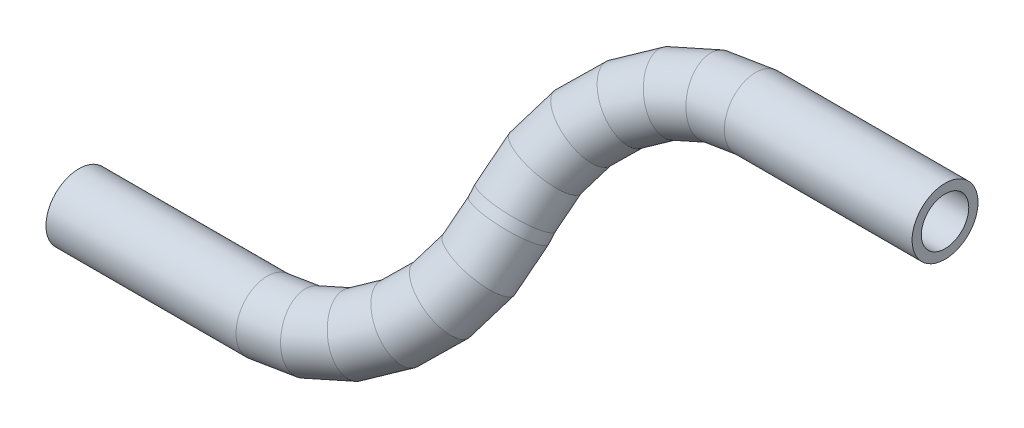
ISO-10303-21;
HEADER;
FILE_DESCRIPTION(('STEP AP214'),'2;1');
FILE_NAME('part.step','',(''),(''),'','','');
FILE_SCHEMA(('AUTOMOTIVE_DESIGN { 1 0 10303 214 1 1 1 1 }'));
ENDSEC;
DATA;
#1=APPLICATION_CONTEXT('core data for automotive mechanical design processes');
#2=APPLICATION_PROTOCOL_DEFINITION('international standard','automotive_design',2000,#1);
#3=PRODUCT_CONTEXT('',#1,'mechanical');
#4=PRODUCT('Part','Part','',(#3));
#5=PRODUCT_RELATED_PRODUCT_CATEGORY('part','',(#4));
#6=PRODUCT_DEFINITION_FORMATION('','',#4);
#7=PRODUCT_DEFINITION_CONTEXT('part definition',#1,'design');
#8=PRODUCT_DEFINITION('design','',#6,#7);
#9=PRODUCT_DEFINITION_SHAPE('','',#8);
#10=(LENGTH_UNIT() NAMED_UNIT(*) SI_UNIT(.MILLI.,.METRE.));
#11=(NAMED_UNIT(*) PLANE_ANGLE_UNIT() SI_UNIT($,.RADIAN.));
#12=(NAMED_UNIT(*) SI_UNIT($,.STERADIAN.) SOLID_ANGLE_UNIT());
#13=UNCERTAINTY_MEASURE_WITH_UNIT(LENGTH_MEASURE(1.E-05),#10,'distance_accuracy_value','');
#14=(GEOMETRIC_REPRESENTATION_CONTEXT(3) GLOBAL_UNCERTAINTY_ASSIGNED_CONTEXT((#13)) GLOBAL_UNIT_ASSIGNED_CONTEXT((#10,
#11,#12)) REPRESENTATION_CONTEXT('',''));
#15=CARTESIAN_POINT('',(0.,0.,0.));
#16=DIRECTION('',(0.,0.,1.));
#17=DIRECTION('',(1.,0.,0.));
#18=AXIS2_PLACEMENT_3D('',#15,#16,#17);
#19=CARTESIAN_POINT('',(-2802.50932273148,-50.1590536512468,36.4426856421346));
#20=DIRECTION('',(-1.,0.,0.));
#21=DIRECTION('',(0.,0.,1.));
#22=AXIS2_PLACEMENT_3D('',#19,#20,#21);
#23=CYLINDRICAL_SURFACE('',#22,3.175);
#24=CARTESIAN_POINT('',(-2803.09277838077,-50.1590536512477,36.4426856421345));
#25=DIRECTION('',(-0.99803668420921,-0.0506704140617951,0.0368142107275359));
#26=DIRECTION('',(0.0626320762284405,-0.807428638534867,0.586631244225063));
#27=AXIS2_PLACEMENT_3D('',#24,#25,#26);
#28=ELLIPSE('',#27,3.18124579009408,3.175);
#29=CARTESIAN_POINT('',(-2802.89353035195,-52.7276826083881,38.3089038181632));
#30=VERTEX_POINT('',#29);
#31=EDGE_CURVE('E45',#30,#30,#28,.T.);
#32=ORIENTED_EDGE('',*,*,#31,.T.);
#33=EDGE_LOOP('',(#32));
#34=FACE_BOUND('',#33,.T.);
#35=CARTESIAN_POINT('',(-2821.29277838077,-50.1590536512468,36.4426856421346));
#36=DIRECTION('',(1.,0.,0.));
#37=DIRECTION('',(0.,0.,-1.));
#38=AXIS2_PLACEMENT_3D('',#35,#36,#37);
#39=CIRCLE('',#38,3.175);
#40=CARTESIAN_POINT('',(-2821.29277838077,-50.1590536512468,33.2676856421346));
#41=VERTEX_POINT('',#40);
#42=EDGE_CURVE('E98',#41,#41,#39,.T.);
#43=ORIENTED_EDGE('',*,*,#42,.T.);
#44=EDGE_LOOP('',(#43));
#45=FACE_BOUND('',#44,.T.);
#46=ADVANCED_FACE('F39',(#34,#45),#23,.T.);
#47=CARTESIAN_POINT('',(-2798.30932314942,-49.6714203188122,36.0883992880472));
#48=DIRECTION('',(-0.99215444605463,-0.101141864075483,0.0734838656125781));
#49=DIRECTION('',(0.101416051901139,-0.994844100558869,0.));
#50=AXIS2_PLACEMENT_3D('',#47,#48,#49);
#51=CYLINDRICAL_SURFACE('',#50,3.175);
#52=CARTESIAN_POINT('',(-2799.37165691525,-49.779716378738,36.1670809811988));
#53=DIRECTION('',(-0.968740889651932,-0.200696700249509,0.145814687961612));
#54=DIRECTION('',(0.248074764368292,-0.783727842874327,0.569411608230085));
#55=AXIS2_PLACEMENT_3D('',#52,#53,#54);
#56=ELLIPSE('',#55,3.20010660903211,3.175);
#57=CARTESIAN_POINT('',(-2798.57779122226,-52.2877290284026,37.9892588319555));
#58=VERTEX_POINT('',#57);
#59=EDGE_CURVE('E136',#58,#58,#56,.T.);
#60=ORIENTED_EDGE('',*,*,#59,.T.);
#61=EDGE_LOOP('',(#60));
#62=FACE_BOUND('',#61,.T.);
#63=ORIENTED_EDGE('',*,*,#31,.F.);
#64=EDGE_LOOP('',(#63));
#65=FACE_BOUND('',#64,.T.);
#66=ADVANCED_FACE('F144',(#62,#65),#51,.T.);
#67=CARTESIAN_POINT('',(-2794.88725479374,-48.3473023497274,35.1263712714111));
#68=DIRECTION('',(-0.930126715431528,-0.297102382846602,0.215857516309784));
#69=DIRECTION('',(0.30427572162067,-0.952584004291601,0.));
#70=AXIS2_PLACEMENT_3D('',#67,#68,#69);
#71=CYLINDRICAL_SURFACE('',#70,3.175);
#72=CARTESIAN_POINT('',(-2795.88317334274,-48.6654200525305,35.3574973114089));
#73=DIRECTION('',(-0.876917822567226,-0.388846199899843,0.28251330108051));
#74=DIRECTION('',(0.480640335868678,-0.709441421127152,0.515439363577454));
#75=AXIS2_PLACEMENT_3D('',#72,#73,#74);
#76=ELLIPSE('',#75,3.20010660903211,3.175);
#77=CARTESIAN_POINT('',(-2794.34507302736,-50.9357082330006,37.0069582253484));
#78=VERTEX_POINT('',#77);
#79=EDGE_CURVE('E131',#78,#78,#76,.T.);
#80=ORIENTED_EDGE('',*,*,#79,.T.);
#81=EDGE_LOOP('',(#80));
#82=FACE_BOUND('',#81,.T.);
#83=ORIENTED_EDGE('',*,*,#59,.F.);
#84=EDGE_LOOP('',(#83));
#85=FACE_BOUND('',#84,.T.);
#86=ADVANCED_FACE('F150',(#82,#85),#71,.T.);
#87=CARTESIAN_POINT('',(-2791.9781811726,-46.3777773033387,33.6954275652379));
#88=DIRECTION('',(-0.809949117537705,-0.47448858927755,0.34473613916341));
#89=DIRECTION('',(0.50547435450549,-0.862841629116988,0.));
#90=AXIS2_PLACEMENT_3D('',#87,#88,#89);
#91=CYLINDRICAL_SURFACE('',#90,3.175);
#92=CARTESIAN_POINT('',(-2792.84542144914,-46.8858284962676,34.0645483633049));
#93=DIRECTION('',(-0.730271413518866,-0.552685727007994,0.401549685292869));
#94=DIRECTION('',(0.683157128775773,-0.590801984042985,0.429242767037157));
#95=AXIS2_PLACEMENT_3D('',#92,#93,#94);
#96=ELLIPSE('',#95,3.20010660903212,3.175);
#97=CARTESIAN_POINT('',(-2790.65924580634,-48.7764578300328,35.4381709789798));
#98=VERTEX_POINT('',#97);
#99=EDGE_CURVE('E132',#98,#98,#96,.T.);
#100=ORIENTED_EDGE('',*,*,#99,.T.);
#101=EDGE_LOOP('',(#100));
#102=FACE_BOUND('',#101,.T.);
#103=ORIENTED_EDGE('',*,*,#79,.F.);
#104=EDGE_LOOP('',(#103));
#105=FACE_BOUND('',#104,.T.);
#106=ADVANCED_FACE('F155',(#102,#105),#91,.T.);
#107=CARTESIAN_POINT('',(-2789.76397239267,-43.8859763811628,31.8850282239544));
#108=DIRECTION('',(-0.639134941960971,-0.622210613366278,0.4520624719869));
#109=DIRECTION('',(0.697556260910853,-0.716530015326692,0.));
#110=AXIS2_PLACEMENT_3D('',#107,#108,#109);
#111=CYLINDRICAL_SURFACE('',#110,3.175);
#112=CARTESIAN_POINT('',(-2790.44831607774,-44.5521986076137,32.3690670045732));
#113=DIRECTION('',(-0.537969735072089,-0.681972325859421,0.495481897659599));
#114=DIRECTION('',(0.842964153535882,-0.4352266581327,0.316210676455074));
#115=AXIS2_PLACEMENT_3D('',#112,#113,#114);
#116=ELLIPSE('',#115,3.20010660903208,3.175);
#117=CARTESIAN_POINT('',(-2787.75074091883,-45.9449703127311,33.3809748801436));
#118=VERTEX_POINT('',#117);
#119=EDGE_CURVE('E126',#118,#118,#116,.T.);
#120=ORIENTED_EDGE('',*,*,#119,.T.);
#121=EDGE_LOOP('',(#120));
#122=FACE_BOUND('',#121,.T.);
#123=ORIENTED_EDGE('',*,*,#99,.F.);
#124=EDGE_LOOP('',(#123));
#125=FACE_BOUND('',#124,.T.);
#126=ADVANCED_FACE('F266',(#122,#125),#111,.T.);
#127=CARTESIAN_POINT('',(-2788.38305684712,-41.0276825431835,29.8083561931266));
#128=DIRECTION('',(-0.428363187028244,-0.731033137009012,0.531126663418218));
#129=DIRECTION('',(0.,-0.587785252292474,-0.809016994374947));
#130=AXIS2_PLACEMENT_3D('',#127,#128,#129);
#131=CYLINDRICAL_SURFACE('',#130,3.175);
#132=CARTESIAN_POINT('',(-2788.84171999118,-41.8104247749689,30.3770517129852));
#133=DIRECTION('',(-0.312035146000277,-0.768623228334108,0.558437463397505));
#134=DIRECTION('',(0.9500705593063,-0.252441735956495,0.183409657015889));
#135=AXIS2_PLACEMENT_3D('',#132,#133,#134);
#136=ELLIPSE('',#135,3.2001066090321,3.175);
#137=CARTESIAN_POINT('',(-2785.8013929153,-42.6182652425988,30.9639821685621));
#138=VERTEX_POINT('',#137);
#139=EDGE_CURVE('E124',#138,#138,#136,.T.);
#140=ORIENTED_EDGE('',*,*,#139,.T.);
#141=EDGE_LOOP('',(#140));
#142=FACE_BOUND('',#141,.T.);
#143=ORIENTED_EDGE('',*,*,#119,.F.);
#144=EDGE_LOOP('',(#143));
#145=FACE_BOUND('',#144,.T.);
#146=ADVANCED_FACE('F265',(#142,#145),#131,.T.);
#147=CARTESIAN_POINT('',(-2788.01474500439,-38.368564900042,27.8763941384157));
#148=DIRECTION('',(-0.190810927830717,-0.794152769656083,0.57698576088839));
#149=DIRECTION('',(0.,-0.587785252292473,-0.809016994374947));
#150=AXIS2_PLACEMENT_3D('',#147,#148,#149);
#151=CYLINDRICAL_SURFACE('',#150,3.175);
#152=CARTESIAN_POINT('',(-2788.12607471818,-38.8319178199037,28.2130397401697));
#153=DIRECTION('',(-0.128954980668213,-0.802262065703807,0.582877509339245));
#154=DIRECTION('',(0.991650448979307,-0.104326770869897,0.0757978358464087));
#155=AXIS2_PLACEMENT_3D('',#152,#153,#154);
#156=ELLIPSE('',#155,3.18124579009406,3.175);
#157=CARTESIAN_POINT('',(-2784.97139090212,-39.1638069205277,28.4541712863544));
#158=VERTEX_POINT('',#157);
#159=EDGE_CURVE('E125',#158,#158,#156,.T.);
#160=ORIENTED_EDGE('',*,*,#159,.T.);
#161=EDGE_LOOP('',(#160));
#162=FACE_BOUND('',#161,.T.);
#163=ORIENTED_EDGE('',*,*,#139,.F.);
#164=EDGE_LOOP('',(#163));
#165=FACE_BOUND('',#164,.T.);
#166=ADVANCED_FACE('F256',(#162,#165),#151,.T.);
#167=CARTESIAN_POINT('',(-2788.02062817105,-37.5537188914046,27.2843738593642));
#168=DIRECTION('',(-0.066592674806016,-0.807221174187645,0.586480512553742));
#169=DIRECTION('',(0.,-0.58778525229247,-0.80901699437495));
#170=AXIS2_PLACEMENT_3D('',#167,#168,#169);
#171=CYLINDRICAL_SURFACE('',#170,3.175);
#172=CARTESIAN_POINT('',(-2788.05948204337,-38.024696645716,27.6265592276158));
#173=DIRECTION('',(-0.128954980668155,-0.802262065703813,0.582877509339249));
#174=DIRECTION('',(-0.991650448979315,0.104326770869849,-0.0757978358463761));
#175=AXIS2_PLACEMENT_3D('',#172,#173,#174);
#176=ELLIPSE('',#175,3.18124579009405,3.175);
#177=CARTESIAN_POINT('',(-2791.21416585943,-37.6928075450922,27.3854276814313));
#178=VERTEX_POINT('',#177);
#179=EDGE_CURVE('E116',#178,#178,#176,.T.);
#180=ORIENTED_EDGE('',*,*,#179,.T.);
#181=EDGE_LOOP('',(#180));
#182=FACE_BOUND('',#181,.T.);
#183=ORIENTED_EDGE('',*,*,#159,.F.);
#184=EDGE_LOOP('',(#183));
#185=FACE_BOUND('',#184,.T.);
#186=ADVANCED_FACE('F255',(#182,#185),#171,.T.);
#187=CARTESIAN_POINT('',(-2787.13952897098,-34.1958631051234,24.8447488277219));
#188=DIRECTION('',(-0.190810927830602,-0.794152769656101,0.576985760888403));
#189=DIRECTION('',(0.,-0.587785252292473,-0.809016994374947));
#190=AXIS2_PLACEMENT_3D('',#187,#188,#189);
#191=CYLINDRICAL_SURFACE('',#190,3.175);
#192=CARTESIAN_POINT('',(-2787.34383677037,-35.0461896906505,25.4625472548011));
#193=DIRECTION('',(-0.312035146000222,-0.768623228334123,0.558437463397515));
#194=DIRECTION('',(-0.950070559306318,0.252441735956448,-0.183409657015858));
#195=AXIS2_PLACEMENT_3D('',#192,#193,#194);
#196=ELLIPSE('',#195,3.20010660903212,3.175);
#197=CARTESIAN_POINT('',(-2790.38416384625,-34.2383492230207,24.8756167992243));
#198=VERTEX_POINT('',#197);
#199=EDGE_CURVE('E117',#198,#198,#196,.T.);
#200=ORIENTED_EDGE('',*,*,#199,.T.);
#201=EDGE_LOOP('',(#200));
#202=FACE_BOUND('',#201,.T.);
#203=ORIENTED_EDGE('',*,*,#179,.F.);
#204=EDGE_LOOP('',(#203));
#205=FACE_BOUND('',#204,.T.);
#206=ADVANCED_FACE('F249',(#202,#205),#191,.T.);
#207=CARTESIAN_POINT('',(-2785.27857753976,-31.5216736262205,22.9018364433546));
#208=DIRECTION('',(-0.428363187028243,-0.731033137009013,0.531126663418218));
#209=DIRECTION('',(0.,-0.587785252292473,-0.809016994374947));
#210=AXIS2_PLACEMENT_3D('',#207,#208,#209);
#211=CYLINDRICAL_SURFACE('',#210,3.175);
#212=CARTESIAN_POINT('',(-2785.73724068381,-32.3044158580067,23.4705319632129));
#213=DIRECTION('',(-0.537969735072089,-0.681972325859421,0.4954818976596));
#214=DIRECTION('',(-0.842964153535882,0.435226658132709,-0.316210676455062));
#215=AXIS2_PLACEMENT_3D('',#212,#213,#214);
#216=ELLIPSE('',#215,3.20010660903208,3.175);
#217=CARTESIAN_POINT('',(-2788.43481584272,-30.9116441528893,22.4586240876425));
#218=VERTEX_POINT('',#217);
#219=EDGE_CURVE('E114',#218,#218,#216,.T.);
#220=ORIENTED_EDGE('',*,*,#219,.T.);
#221=EDGE_LOOP('',(#220));
#222=FACE_BOUND('',#221,.T.);
#223=ORIENTED_EDGE('',*,*,#199,.F.);
#224=EDGE_LOOP('',(#223));
#225=FACE_BOUND('',#224,.T.);
#226=ADVANCED_FACE('F246',(#222,#225),#211,.T.);
#227=CARTESIAN_POINT('',(-2782.65579162735,-29.3045637429017,21.2910118238623));
#228=DIRECTION('',(-0.639134941960972,-0.622210613366276,0.452062471986901));
#229=DIRECTION('',(0.697556260910852,-0.716530015326694,0.));
#230=AXIS2_PLACEMENT_3D('',#227,#228,#229);
#231=CYLINDRICAL_SURFACE('',#230,3.175);
#232=CARTESIAN_POINT('',(-2783.34013531241,-29.9707859693524,21.7750506044815));
#233=DIRECTION('',(-0.730271413518866,-0.552685727007994,0.401549685292869));
#234=DIRECTION('',(-0.683157128775772,0.590801984042976,-0.429242767037171));
#235=AXIS2_PLACEMENT_3D('',#232,#233,#234);
#236=ELLIPSE('',#235,3.20010660903212,3.175);
#237=CARTESIAN_POINT('',(-2785.52631095521,-28.0801566355872,20.4014279888066));
#238=VERTEX_POINT('',#237);
#239=EDGE_CURVE('E109',#238,#238,#236,.T.);
#240=ORIENTED_EDGE('',*,*,#239,.T.);
#241=EDGE_LOOP('',(#240));
#242=FACE_BOUND('',#241,.T.);
#243=ORIENTED_EDGE('',*,*,#219,.F.);
#244=EDGE_LOOP('',(#243));
#245=FACE_BOUND('',#244,.T.);
#246=ADVANCED_FACE('F245',(#242,#245),#231,.T.);
#247=CARTESIAN_POINT('',(-2779.43514314227,-27.683143220161,20.1129808583108));
#248=DIRECTION('',(-0.809949117537705,-0.474488589277551,0.344736139163409));
#249=DIRECTION('',(0.505474354505491,-0.862841629116988,0.));
#250=AXIS2_PLACEMENT_3D('',#247,#248,#249);
#251=CYLINDRICAL_SURFACE('',#250,3.175);
#252=CARTESIAN_POINT('',(-2780.3023834188,-28.1911944130903,20.4821016563773));
#253=DIRECTION('',(-0.876917822567236,-0.388846199899828,0.282513301080498));
#254=DIRECTION('',(-0.480640335868659,0.709441421127171,-0.515439363577447));
#255=AXIS2_PLACEMENT_3D('',#252,#253,#254);
#256=ELLIPSE('',#255,3.20010660903211,3.175);
#257=CARTESIAN_POINT('',(-2781.84048373419,-25.9209062326201,18.8326407424378));
#258=VERTEX_POINT('',#257);
#259=EDGE_CURVE('E110',#258,#258,#256,.T.);
#260=ORIENTED_EDGE('',*,*,#259,.T.);
#261=EDGE_LOOP('',(#260));
#262=FACE_BOUND('',#261,.T.);
#263=ORIENTED_EDGE('',*,*,#239,.F.);
#264=EDGE_LOOP('',(#263));
#265=FACE_BOUND('',#264,.T.);
#266=ADVANCED_FACE('F236',(#262,#265),#251,.T.);
#267=CARTESIAN_POINT('',(-2775.8179812973,-26.7587803840796,19.4413919465896));
#268=DIRECTION('',(-0.930126715431544,-0.297102382846568,0.215857516309762));
#269=DIRECTION('',(0.304275721620634,-0.952584004291612,0.));
#270=AXIS2_PLACEMENT_3D('',#267,#268,#269);
#271=CYLINDRICAL_SURFACE('',#270,3.175);
#272=CARTESIAN_POINT('',(-2776.8138998463,-27.0768980868826,19.6725179865873));
#273=DIRECTION('',(-0.968740889651936,-0.200696700249497,0.145814687961604));
#274=DIRECTION('',(-0.248074764368277,0.783727842874321,-0.569411608230099));
#275=AXIS2_PLACEMENT_3D('',#272,#273,#274);
#276=ELLIPSE('',#275,3.2001066090321,3.175);
#277=CARTESIAN_POINT('',(-2777.60776553929,-24.568885437218,17.8503401358306));
#278=VERTEX_POINT('',#277);
#279=EDGE_CURVE('E102',#278,#278,#276,.T.);
#280=ORIENTED_EDGE('',*,*,#279,.T.);
#281=EDGE_LOOP('',(#280));
#282=FACE_BOUND('',#281,.T.);
#283=ORIENTED_EDGE('',*,*,#259,.F.);
#284=EDGE_LOOP('',(#283));
#285=FACE_BOUND('',#284,.T.);
#286=ADVANCED_FACE('F233',(#282,#285),#271,.T.);
#287=CARTESIAN_POINT('',(-2772.51390026425,-26.6385490223978,19.3540387491277));
#288=DIRECTION('',(-0.992154446054628,-0.101141864075495,0.0734838656125849));
#289=DIRECTION('',(0.101416051901151,-0.994844100558868,0.));
#290=AXIS2_PLACEMENT_3D('',#287,#288,#289);
#291=CYLINDRICAL_SURFACE('',#290,3.175);
#292=CARTESIAN_POINT('',(-2773.09277838077,-26.6975608143733,19.3969133256516));
#293=DIRECTION('',(-0.99803668420921,-0.0506704140618011,0.0368142107275393));
#294=DIRECTION('',(-0.0626320762284474,0.807428638534874,-0.586631244225053));
#295=AXIS2_PLACEMENT_3D('',#292,#293,#294);
#296=ELLIPSE('',#295,3.18124579009408,3.175);
#297=CARTESIAN_POINT('',(-2773.2920264096,-24.1289318572328,17.530695149623));
#298=VERTEX_POINT('',#297);
#299=EDGE_CURVE('E101',#298,#298,#296,.T.);
#300=ORIENTED_EDGE('',*,*,#299,.T.);
#301=EDGE_LOOP('',(#300));
#302=FACE_BOUND('',#301,.T.);
#303=ORIENTED_EDGE('',*,*,#279,.F.);
#304=EDGE_LOOP('',(#303));
#305=FACE_BOUND('',#304,.T.);
#306=ADVANCED_FACE('F228',(#302,#305),#291,.T.);
#307=CARTESIAN_POINT('',(-2754.89277838077,-26.6975608143733,19.3969133256516));
#308=DIRECTION('',(-1.,0.,0.));
#309=DIRECTION('',(0.,0.,1.));
#310=AXIS2_PLACEMENT_3D('',#307,#308,#309);
#311=CYLINDRICAL_SURFACE('',#310,3.175);
#312=CARTESIAN_POINT('',(-2754.89277838077,-26.6975608143733,19.3969133256516));
#313=DIRECTION('',(1.,0.,0.));
#314=DIRECTION('',(0.,0.,-1.));
#315=AXIS2_PLACEMENT_3D('',#312,#313,#314);
#316=CIRCLE('',#315,3.175);
#317=CARTESIAN_POINT('',(-2754.89277838077,-26.6975608143733,16.2219133256516));
#318=VERTEX_POINT('',#317);
#319=EDGE_CURVE('E92',#318,#318,#316,.T.);
#320=ORIENTED_EDGE('',*,*,#319,.F.);
#321=EDGE_LOOP('',(#320));
#322=FACE_BOUND('',#321,.T.);
#323=ORIENTED_EDGE('',*,*,#299,.F.);
#324=EDGE_LOOP('',(#323));
#325=FACE_BOUND('',#324,.T.);
#326=ADVANCED_FACE('F227',(#322,#325),#311,.T.);
#327=CARTESIAN_POINT('',(-2821.29277838077,-50.1590536512468,36.4426856421346));
#328=DIRECTION('',(1.,0.,0.));
#329=DIRECTION('',(0.,0.,-1.));
#330=AXIS2_PLACEMENT_3D('',#327,#328,#329);
#331=PLANE('',#330);
#332=CARTESIAN_POINT('',(-2821.29277838077,-50.1590536512468,36.4426856421346));
#333=DIRECTION('',(1.,0.,0.));
#334=DIRECTION('',(0.,0.,-1.));
#335=AXIS2_PLACEMENT_3D('',#332,#333,#334);
#336=CIRCLE('',#335,2.286);
#337=CARTESIAN_POINT('',(-2821.29277838077,-50.1590536512468,34.1566856421346));
#338=VERTEX_POINT('',#337);
#339=EDGE_CURVE('E95',#338,#338,#336,.F.);
#340=ORIENTED_EDGE('',*,*,#339,.F.);
#341=EDGE_LOOP('',(#340));
#342=FACE_BOUND('',#341,.T.);
#343=ORIENTED_EDGE('',*,*,#42,.F.);
#344=EDGE_LOOP('',(#343));
#345=FACE_BOUND('',#344,.T.);
#346=ADVANCED_FACE('F225',(#342,#345),#331,.F.);
#347=CARTESIAN_POINT('',(-2754.89277838077,-26.6975608143733,19.3969133256516));
#348=DIRECTION('',(1.,0.,0.));
#349=DIRECTION('',(0.,0.,-1.));
#350=AXIS2_PLACEMENT_3D('',#347,#348,#349);
#351=PLANE('',#350);
#352=CARTESIAN_POINT('',(-2754.89277838077,-26.6975608143733,19.3969133256516));
#353=DIRECTION('',(1.,0.,0.));
#354=DIRECTION('',(0.,0.,-1.));
#355=AXIS2_PLACEMENT_3D('',#352,#353,#354);
#356=CIRCLE('',#355,2.286);
#357=CARTESIAN_POINT('',(-2754.89277838077,-26.6975608143733,17.1109133256516));
#358=VERTEX_POINT('',#357);
#359=EDGE_CURVE('E46',#358,#358,#356,.F.);
#360=ORIENTED_EDGE('',*,*,#359,.T.);
#361=EDGE_LOOP('',(#360));
#362=FACE_BOUND('',#361,.T.);
#363=ORIENTED_EDGE('',*,*,#319,.T.);
#364=EDGE_LOOP('',(#363));
#365=FACE_BOUND('',#364,.T.);
#366=ADVANCED_FACE('F217',(#362,#365),#351,.T.);
#367=CARTESIAN_POINT('',(-2802.64469031328,-50.1590536512468,36.4426856421346));
#368=DIRECTION('',(-1.,0.,0.));
#369=DIRECTION('',(0.,0.,1.));
#370=AXIS2_PLACEMENT_3D('',#367,#368,#369);
#371=CYLINDRICAL_SURFACE('',#370,2.286);
#372=CARTESIAN_POINT('',(-2803.09277838077,-50.1590536512477,36.4426856421345));
#373=DIRECTION('',(-0.99803668420921,-0.0506704140617951,0.0368142107275359));
#374=DIRECTION('',(0.0626320762284405,-0.807428638534867,0.586631244225063));
#375=AXIS2_PLACEMENT_3D('',#372,#373,#374);
#376=ELLIPSE('',#375,2.29049696886773,2.286);
#377=CARTESIAN_POINT('',(-2802.94931980002,-52.0084665003888,37.7863627288752));
#378=VERTEX_POINT('',#377);
#379=EDGE_CURVE('E90',#378,#378,#376,.F.);
#380=ORIENTED_EDGE('',*,*,#379,.T.);
#381=EDGE_LOOP('',(#380));
#382=FACE_BOUND('',#381,.T.);
#383=ORIENTED_EDGE('',*,*,#339,.T.);
#384=EDGE_LOOP('',(#383));
#385=FACE_BOUND('',#384,.T.);
#386=ADVANCED_FACE('F212',(#382,#385),#371,.F.);
#387=CARTESIAN_POINT('',(-2798.57899627937,-49.6989112433973,36.1083726138925));
#388=DIRECTION('',(-0.99215444605463,-0.101141864075483,0.0734838656125781));
#389=DIRECTION('',(0.101416051901139,-0.994844100558869,0.));
#390=AXIS2_PLACEMENT_3D('',#387,#388,#389);
#391=CYLINDRICAL_SURFACE('',#390,2.286);
#392=CARTESIAN_POINT('',(-2799.37165691525,-49.7797163787381,36.1670809811989));
#393=DIRECTION('',(-0.968740889651932,-0.200696700249509,0.145814687961612));
#394=DIRECTION('',(0.248074764368292,-0.783727842874327,0.569411608230085));
#395=AXIS2_PLACEMENT_3D('',#392,#393,#394);
#396=ELLIPSE('',#395,2.30407675850312,2.286);
#397=CARTESIAN_POINT('',(-2798.8000736163,-51.5854854864966,37.4790490337437));
#398=VERTEX_POINT('',#397);
#399=EDGE_CURVE('E88',#398,#398,#396,.F.);
#400=ORIENTED_EDGE('',*,*,#399,.T.);
#401=EDGE_LOOP('',(#400));
#402=FACE_BOUND('',#401,.T.);
#403=ORIENTED_EDGE('',*,*,#379,.F.);
#404=EDGE_LOOP('',(#403));
#405=FACE_BOUND('',#404,.T.);
#406=ADVANCED_FACE('F209',(#402,#405),#391,.F.);
#407=CARTESIAN_POINT('',(-2795.14006843943,-48.4280564397926,35.1850425521539));
#408=DIRECTION('',(-0.930126715431528,-0.297102382846602,0.215857516309784));
#409=DIRECTION('',(0.30427572162067,-0.952584004291601,0.));
#410=AXIS2_PLACEMENT_3D('',#407,#408,#409);
#411=CYLINDRICAL_SURFACE('',#410,2.286);
#412=CARTESIAN_POINT('',(-2795.88317334274,-48.6654200525305,35.3574973114089));
#413=DIRECTION('',(-0.876917822567226,-0.388846199899843,0.28251330108051));
#414=DIRECTION('',(0.480640335868678,-0.709441421127153,0.515439363577454));
#415=AXIS2_PLACEMENT_3D('',#412,#413,#414);
#416=ELLIPSE('',#415,2.30407675850311,2.286);
#417=CARTESIAN_POINT('',(-2794.77574111567,-50.300027542469,36.5451091694453));
#418=VERTEX_POINT('',#417);
#419=EDGE_CURVE('E82',#418,#418,#416,.F.);
#420=ORIENTED_EDGE('',*,*,#419,.T.);
#421=EDGE_LOOP('',(#420));
#422=FACE_BOUND('',#421,.T.);
#423=ORIENTED_EDGE('',*,*,#399,.F.);
#424=EDGE_LOOP('',(#423));
#425=FACE_BOUND('',#424,.T.);
#426=ADVANCED_FACE('F206',(#422,#425),#411,.F.);
#427=CARTESIAN_POINT('',(-2792.19832987474,-46.5067459568591,33.7891287768001));
#428=DIRECTION('',(-0.809949117537705,-0.47448858927755,0.34473613916341));
#429=DIRECTION('',(0.50547435450549,-0.862841629116988,0.));
#430=AXIS2_PLACEMENT_3D('',#427,#428,#429);
#431=CYLINDRICAL_SURFACE('',#430,2.286);
#432=CARTESIAN_POINT('',(-2792.84542144914,-46.8858284962676,34.0645483633049));
#433=DIRECTION('',(-0.730271413518866,-0.552685727007995,0.401549685292869));
#434=DIRECTION('',(0.683157128775773,-0.590801984042984,0.429242767037158));
#435=AXIS2_PLACEMENT_3D('',#432,#433,#434);
#436=ELLIPSE('',#435,2.30407675850312,2.286);
#437=CARTESIAN_POINT('',(-2791.27137498632,-48.2470816165786,35.0535566465908));
#438=VERTEX_POINT('',#437);
#439=EDGE_CURVE('E78',#438,#438,#436,.F.);
#440=ORIENTED_EDGE('',*,*,#439,.T.);
#441=EDGE_LOOP('',(#440));
#442=FACE_BOUND('',#441,.T.);
#443=ORIENTED_EDGE('',*,*,#419,.F.);
#444=EDGE_LOOP('',(#443));
#445=FACE_BOUND('',#444,.T.);
#446=ADVANCED_FACE('F205',(#442,#445),#431,.F.);
#447=CARTESIAN_POINT('',(-2789.93769284612,-44.0550967073947,32.0079013333121));
#448=DIRECTION('',(-0.639134941960971,-0.622210613366278,0.4520624719869));
#449=DIRECTION('',(0.697556260910853,-0.716530015326692,0.));
#450=AXIS2_PLACEMENT_3D('',#447,#448,#449);
#451=CYLINDRICAL_SURFACE('',#450,2.286);
#452=CARTESIAN_POINT('',(-2790.44831607774,-44.5521986076135,32.3690670045732));
#453=DIRECTION('',(-0.537969735072089,-0.681972325859421,0.495481897659599));
#454=DIRECTION('',(0.842964153535882,-0.435226658132701,0.316210676455073));
#455=AXIS2_PLACEMENT_3D('',#452,#453,#454);
#456=ELLIPSE('',#455,2.3040767585031,2.286);
#457=CARTESIAN_POINT('',(-2788.50606196332,-45.554994235298,33.0976406749839));
#458=VERTEX_POINT('',#457);
#459=EDGE_CURVE('E80',#458,#458,#456,.F.);
#460=ORIENTED_EDGE('',*,*,#459,.T.);
#461=EDGE_LOOP('',(#460));
#462=FACE_BOUND('',#461,.T.);
#463=ORIENTED_EDGE('',*,*,#439,.F.);
#464=EDGE_LOOP('',(#463));
#465=FACE_BOUND('',#464,.T.);
#466=ADVANCED_FACE('F196',(#462,#465),#451,.F.);
#467=CARTESIAN_POINT('',(-2788.49948835822,-41.2263814402472,29.9527193921112));
#468=DIRECTION('',(-0.428363187028244,-0.731033137009012,0.531126663418218));
#469=DIRECTION('',(0.,-0.587785252292474,-0.809016994374947));
#470=AXIS2_PLACEMENT_3D('',#467,#468,#469);
#471=CYLINDRICAL_SURFACE('',#470,2.286);
#472=CARTESIAN_POINT('',(-2788.84171999118,-41.8104247749688,30.3770517129851));
#473=DIRECTION('',(-0.312035146000277,-0.768623228334108,0.558437463397505));
#474=DIRECTION('',(0.9500705593063,-0.252441735956495,0.183409657015887));
#475=AXIS2_PLACEMENT_3D('',#472,#473,#474);
#476=ELLIPSE('',#475,2.30407675850311,2.286);
#477=CARTESIAN_POINT('',(-2786.65268449654,-42.3920699116624,30.7996416410004));
#478=VERTEX_POINT('',#477);
#479=EDGE_CURVE('E74',#478,#478,#476,.F.);
#480=ORIENTED_EDGE('',*,*,#479,.T.);
#481=EDGE_LOOP('',(#480));
#482=FACE_BOUND('',#481,.T.);
#483=ORIENTED_EDGE('',*,*,#459,.F.);
#484=EDGE_LOOP('',(#483));
#485=FACE_BOUND('',#484,.T.);
#486=ADVANCED_FACE('F193',(#482,#485),#471,.F.);
#487=CARTESIAN_POINT('',(-2788.04057461827,-38.4760674400528,27.954499305602));
#488=DIRECTION('',(-0.190810927830717,-0.794152769656083,0.57698576088839));
#489=DIRECTION('',(0.,-0.587785252292473,-0.809016994374947));
#490=AXIS2_PLACEMENT_3D('',#487,#488,#489);
#491=CYLINDRICAL_SURFACE('',#490,2.286);
#492=CARTESIAN_POINT('',(-2788.12607471818,-38.8319178199036,28.2130397401699));
#493=DIRECTION('',(-0.128954980668213,-0.802262065703807,0.582877509339245));
#494=DIRECTION('',(0.991650448979307,-0.104326770869898,0.0757978358464065));
#495=AXIS2_PLACEMENT_3D('',#492,#493,#494);
#496=ELLIPSE('',#495,2.29049696886772,2.286);
#497=CARTESIAN_POINT('',(-2785.85470237061,-39.0708779723529,28.3866544534228));
#498=VERTEX_POINT('',#497);
#499=EDGE_CURVE('E72',#498,#498,#496,.F.);
#500=ORIENTED_EDGE('',*,*,#499,.T.);
#501=EDGE_LOOP('',(#500));
#502=FACE_BOUND('',#501,.T.);
#503=ORIENTED_EDGE('',*,*,#479,.F.);
#504=EDGE_LOOP('',(#503));
#505=FACE_BOUND('',#504,.T.);
#506=ADVANCED_FACE('F188',(#502,#505),#491,.F.);
#507=CARTESIAN_POINT('',(-2788.02964266041,-37.6629904697343,27.3637643081233));
#508=DIRECTION('',(-0.0665926748060161,-0.807221174187645,0.586480512553742));
#509=DIRECTION('',(0.,-0.58778525229247,-0.80901699437495));
#510=AXIS2_PLACEMENT_3D('',#507,#508,#509);
#511=CYLINDRICAL_SURFACE('',#510,2.286);
#512=CARTESIAN_POINT('',(-2788.05948204337,-38.0246966457158,27.626559227616));
#513=DIRECTION('',(-0.128954980668155,-0.802262065703813,0.582877509339249));
#514=DIRECTION('',(-0.991650448979315,0.104326770869851,-0.075797835846374));
#515=AXIS2_PLACEMENT_3D('',#512,#513,#514);
#516=ELLIPSE('',#515,2.29049696886771,2.286);
#517=CARTESIAN_POINT('',(-2790.33085439093,-37.7857364932667,27.4529445143632));
#518=VERTEX_POINT('',#517);
#519=EDGE_CURVE('E67',#518,#518,#516,.F.);
#520=ORIENTED_EDGE('',*,*,#519,.T.);
#521=EDGE_LOOP('',(#520));
#522=FACE_BOUND('',#521,.T.);
#523=ORIENTED_EDGE('',*,*,#499,.F.);
#524=EDGE_LOOP('',(#523));
#525=FACE_BOUND('',#524,.T.);
#526=ADVANCED_FACE('F187',(#522,#525),#511,.F.);
#527=CARTESIAN_POINT('',(-2787.19139244883,-34.4117182715205,25.0015767859995));
#528=DIRECTION('',(-0.190810927830602,-0.794152769656101,0.576985760888403));
#529=DIRECTION('',(0.,-0.587785252292473,-0.809016994374947));
#530=AXIS2_PLACEMENT_3D('',#527,#528,#529);
#531=CYLINDRICAL_SURFACE('',#530,2.286);
#532=CARTESIAN_POINT('',(-2787.34383677037,-35.0461896906505,25.4625472548011));
#533=DIRECTION('',(-0.312035146000222,-0.768623228334123,0.558437463397515));
#534=DIRECTION('',(-0.950070559306318,0.252441735956447,-0.183409657015859));
#535=AXIS2_PLACEMENT_3D('',#532,#533,#534);
#536=ELLIPSE('',#535,2.30407675850313,2.286);
#537=CARTESIAN_POINT('',(-2789.532872265,-34.464544553957,25.0399573267858));
#538=VERTEX_POINT('',#537);
#539=EDGE_CURVE('E63',#538,#538,#536,.F.);
#540=ORIENTED_EDGE('',*,*,#539,.T.);
#541=EDGE_LOOP('',(#540));
#542=FACE_BOUND('',#541,.T.);
#543=ORIENTED_EDGE('',*,*,#519,.F.);
#544=EDGE_LOOP('',(#543));
#545=FACE_BOUND('',#544,.T.);
#546=ADVANCED_FACE('F185',(#542,#545),#531,.F.);
#547=CARTESIAN_POINT('',(-2785.39500905086,-31.7203725232846,23.0461996423394));
#548=DIRECTION('',(-0.428363187028243,-0.731033137009013,0.531126663418218));
#549=DIRECTION('',(0.,-0.587785252292473,-0.809016994374947));
#550=AXIS2_PLACEMENT_3D('',#547,#548,#549);
#551=CYLINDRICAL_SURFACE('',#550,2.286);
#552=CARTESIAN_POINT('',(-2785.73724068381,-32.3044158580067,23.4705319632129));
#553=DIRECTION('',(-0.537969735072089,-0.681972325859421,0.4954818976596));
#554=DIRECTION('',(-0.842964153535882,0.435226658132709,-0.316210676455062));
#555=AXIS2_PLACEMENT_3D('',#552,#553,#554);
#556=ELLIPSE('',#555,2.3040767585031,2.286);
#557=CARTESIAN_POINT('',(-2787.67949479823,-31.3016202303221,22.7419582928022));
#558=VERTEX_POINT('',#557);
#559=EDGE_CURVE('E65',#558,#558,#556,.F.);
#560=ORIENTED_EDGE('',*,*,#559,.T.);
#561=EDGE_LOOP('',(#560));
#562=FACE_BOUND('',#561,.T.);
#563=ORIENTED_EDGE('',*,*,#539,.F.);
#564=EDGE_LOOP('',(#563));
#565=FACE_BOUND('',#564,.T.);
#566=ADVANCED_FACE('F177',(#562,#565),#551,.F.);
#567=CARTESIAN_POINT('',(-2782.82951208079,-29.4736840691336,21.4138849332199));
#568=DIRECTION('',(-0.639134941960971,-0.622210613366276,0.452062471986901));
#569=DIRECTION('',(0.697556260910852,-0.716530015326694,0.));
#570=AXIS2_PLACEMENT_3D('',#567,#568,#569);
#571=CYLINDRICAL_SURFACE('',#570,2.286);
#572=CARTESIAN_POINT('',(-2783.34013531241,-29.9707859693523,21.7750506044814));
#573=DIRECTION('',(-0.730271413518866,-0.552685727007994,0.401549685292869));
#574=DIRECTION('',(-0.683157128775772,0.590801984042976,-0.429242767037171));
#575=AXIS2_PLACEMENT_3D('',#572,#573,#574);
#576=ELLIPSE('',#575,2.30407675850312,2.286);
#577=CARTESIAN_POINT('',(-2784.91418177523,-28.6095328490413,20.7860423211955));
#578=VERTEX_POINT('',#577);
#579=EDGE_CURVE('E56',#578,#578,#576,.F.);
#580=ORIENTED_EDGE('',*,*,#579,.T.);
#581=EDGE_LOOP('',(#580));
#582=FACE_BOUND('',#581,.T.);
#583=ORIENTED_EDGE('',*,*,#559,.F.);
#584=EDGE_LOOP('',(#583));
#585=FACE_BOUND('',#584,.T.);
#586=ADVANCED_FACE('F171',(#582,#585),#571,.F.);
#587=CARTESIAN_POINT('',(-2779.65529184441,-27.8121118736812,20.2066820698729));
#588=DIRECTION('',(-0.809949117537705,-0.474488589277551,0.344736139163409));
#589=DIRECTION('',(0.505474354505491,-0.862841629116988,0.));
#590=AXIS2_PLACEMENT_3D('',#587,#588,#589);
#591=CYLINDRICAL_SURFACE('',#590,2.286);
#592=CARTESIAN_POINT('',(-2780.3023834188,-28.1911944130902,20.4821016563772));
#593=DIRECTION('',(-0.876917822567236,-0.388846199899828,0.282513301080498));
#594=DIRECTION('',(-0.480640335868659,0.70944142112717,-0.515439363577447));
#595=AXIS2_PLACEMENT_3D('',#592,#593,#594);
#596=ELLIPSE('',#595,2.30407675850312,2.286);
#597=CARTESIAN_POINT('',(-2781.40981564588,-26.5565869231517,19.2944897983408));
#598=VERTEX_POINT('',#597);
#599=EDGE_CURVE('E57',#598,#598,#596,.F.);
#600=ORIENTED_EDGE('',*,*,#599,.T.);
#601=EDGE_LOOP('',(#600));
#602=FACE_BOUND('',#601,.T.);
#603=ORIENTED_EDGE('',*,*,#579,.F.);
#604=EDGE_LOOP('',(#603));
#605=FACE_BOUND('',#604,.T.);
#606=ADVANCED_FACE('F168',(#602,#605),#591,.F.);
#607=CARTESIAN_POINT('',(-2776.07079494299,-26.8395344741449,19.5000632273323));
#608=DIRECTION('',(-0.930126715431544,-0.297102382846568,0.215857516309762));
#609=DIRECTION('',(0.304275721620634,-0.952584004291612,0.));
#610=AXIS2_PLACEMENT_3D('',#607,#608,#609);
#611=CYLINDRICAL_SURFACE('',#610,2.286);
#612=CARTESIAN_POINT('',(-2776.8138998463,-27.0768980868826,19.6725179865873));
#613=DIRECTION('',(-0.968740889651936,-0.200696700249497,0.145814687961604));
#614=DIRECTION('',(-0.248074764368277,0.783727842874321,-0.569411608230099));
#615=AXIS2_PLACEMENT_3D('',#612,#613,#614);
#616=ELLIPSE('',#615,2.30407675850311,2.286);
#617=CARTESIAN_POINT('',(-2777.38548314525,-25.2711289791241,18.3605499340424));
#618=VERTEX_POINT('',#617);
#619=EDGE_CURVE('E51',#618,#618,#616,.F.);
#620=ORIENTED_EDGE('',*,*,#619,.T.);
#621=EDGE_LOOP('',(#620));
#622=FACE_BOUND('',#621,.T.);
#623=ORIENTED_EDGE('',*,*,#599,.F.);
#624=EDGE_LOOP('',(#623));
#625=FACE_BOUND('',#624,.T.);
#626=ADVANCED_FACE('F162',(#622,#625),#611,.F.);
#627=CARTESIAN_POINT('',(-2772.64820581239,-26.6522403519568,19.3639860823172));
#628=DIRECTION('',(-0.992154446054628,-0.101141864075495,0.0734838656125849));
#629=DIRECTION('',(0.101416051901151,-0.994844100558868,0.));
#630=AXIS2_PLACEMENT_3D('',#627,#628,#629);
#631=CYLINDRICAL_SURFACE('',#630,2.286);
#632=CARTESIAN_POINT('',(-2773.09277838077,-26.6975608143733,19.3969133256516));
#633=DIRECTION('',(-0.99803668420921,-0.0506704140618011,0.0368142107275393));
#634=DIRECTION('',(-0.0626320762284473,0.807428638534874,-0.586631244225053));
#635=AXIS2_PLACEMENT_3D('',#632,#633,#634);
#636=ELLIPSE('',#635,2.29049696886773,2.286);
#637=CARTESIAN_POINT('',(-2773.23623696153,-24.8481479652321,18.053236238911));
#638=VERTEX_POINT('',#637);
#639=EDGE_CURVE('E10',#638,#638,#636,.F.);
#640=ORIENTED_EDGE('',*,*,#639,.T.);
#641=EDGE_LOOP('',(#640));
#642=FACE_BOUND('',#641,.T.);
#643=ORIENTED_EDGE('',*,*,#619,.F.);
#644=EDGE_LOOP('',(#643));
#645=FACE_BOUND('',#644,.T.);
#646=ADVANCED_FACE('F160',(#642,#645),#631,.F.);
#647=CARTESIAN_POINT('',(-2754.89277838077,-26.6975608143733,19.3969133256516));
#648=DIRECTION('',(-1.,0.,0.));
#649=DIRECTION('',(0.,0.,1.));
#650=AXIS2_PLACEMENT_3D('',#647,#648,#649);
#651=CYLINDRICAL_SURFACE('',#650,2.286);
#652=ORIENTED_EDGE('',*,*,#359,.F.);
#653=EDGE_LOOP('',(#652));
#654=FACE_BOUND('',#653,.T.);
#655=ORIENTED_EDGE('',*,*,#639,.F.);
#656=EDGE_LOOP('',(#655));
#657=FACE_BOUND('',#656,.T.);
#658=ADVANCED_FACE('F154',(#654,#657),#651,.F.);
#659=CLOSED_SHELL('',(#46,#66,#86,#106,#126,#146,#166,#186,#206,#226,#246,#266,#286,#306,#326,
#346,#366,#386,#406,#426,#446,#466,#486,#506,#526,#546,#566,#586,#606,#626,#646,#658));
#660=MANIFOLD_SOLID_BREP('B2',#659);
#661=ADVANCED_BREP_SHAPE_REPRESENTATION('',(#18,#660),#14);
#662=SHAPE_DEFINITION_REPRESENTATION(#9,#661);
ENDSEC;
END-ISO-10303-21;
